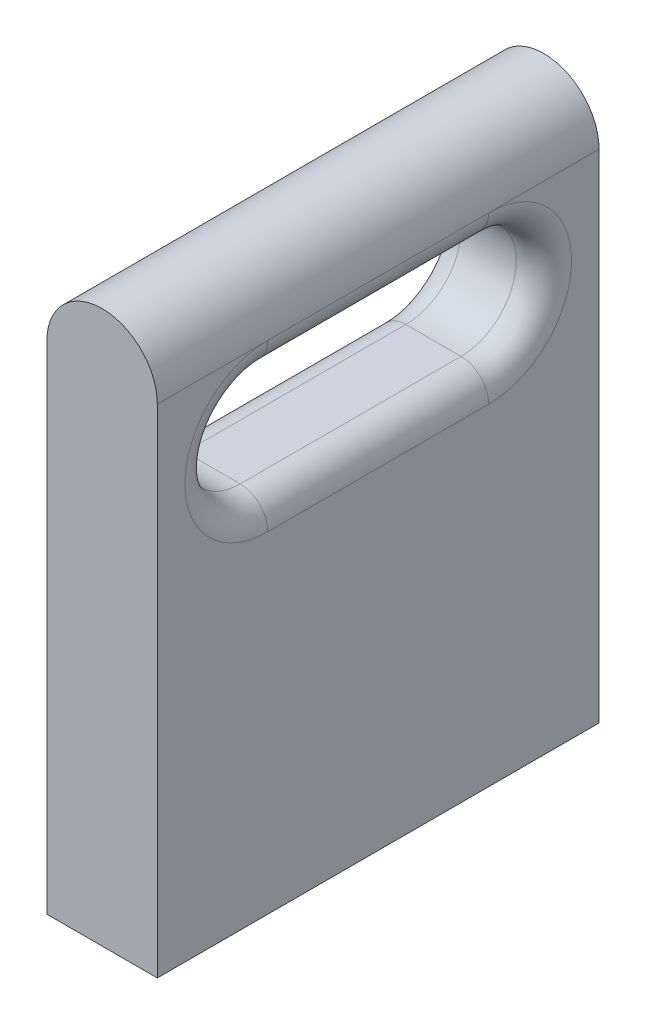
ISO-10303-21;
HEADER;
FILE_DESCRIPTION(('STEP AP214'),'2;1');
FILE_NAME('part.step','',(''),(''),'','','');
FILE_SCHEMA(('AUTOMOTIVE_DESIGN { 1 0 10303 214 1 1 1 1 }'));
ENDSEC;
DATA;
#1=APPLICATION_CONTEXT('core data for automotive mechanical design processes');
#2=APPLICATION_PROTOCOL_DEFINITION('international standard','automotive_design',2000,#1);
#3=PRODUCT_CONTEXT('',#1,'mechanical');
#4=PRODUCT('Part','Part','',(#3));
#5=PRODUCT_RELATED_PRODUCT_CATEGORY('part','',(#4));
#6=PRODUCT_DEFINITION_FORMATION('','',#4);
#7=PRODUCT_DEFINITION_CONTEXT('part definition',#1,'design');
#8=PRODUCT_DEFINITION('design','',#6,#7);
#9=PRODUCT_DEFINITION_SHAPE('','',#8);
#10=(LENGTH_UNIT() NAMED_UNIT(*) SI_UNIT(.MILLI.,.METRE.));
#11=(NAMED_UNIT(*) PLANE_ANGLE_UNIT() SI_UNIT($,.RADIAN.));
#12=(NAMED_UNIT(*) SI_UNIT($,.STERADIAN.) SOLID_ANGLE_UNIT());
#13=UNCERTAINTY_MEASURE_WITH_UNIT(LENGTH_MEASURE(1.E-05),#10,'distance_accuracy_value','');
#14=(GEOMETRIC_REPRESENTATION_CONTEXT(3) GLOBAL_UNCERTAINTY_ASSIGNED_CONTEXT((#13)) GLOBAL_UNIT_ASSIGNED_CONTEXT((#10,
#11,#12)) REPRESENTATION_CONTEXT('',''));
#15=CARTESIAN_POINT('',(0.,0.,0.));
#16=DIRECTION('',(0.,0.,1.));
#17=DIRECTION('',(1.,0.,0.));
#18=AXIS2_PLACEMENT_3D('',#15,#16,#17);
#19=CARTESIAN_POINT('',(0.,0.,101.6));
#20=DIRECTION('',(1.,0.,0.));
#21=DIRECTION('',(0.,0.,-1.));
#22=AXIS2_PLACEMENT_3D('',#19,#20,#21);
#23=PLANE('',#22);
#24=DIRECTION('',(0.,0.,-1.));
#25=VECTOR('',#24,1.);
#26=CARTESIAN_POINT('',(0.,114.3,101.6));
#27=LINE('',#26,#25);
#28=CARTESIAN_POINT('',(0.,114.3,101.6));
#29=VERTEX_POINT('',#28);
#30=CARTESIAN_POINT('',(0.,114.3,76.2));
#31=VERTEX_POINT('',#30);
#32=EDGE_CURVE('E239',#29,#31,#27,.T.);
#33=ORIENTED_EDGE('',*,*,#32,.T.);
#34=CARTESIAN_POINT('',(0.,95.25,76.2));
#35=DIRECTION('',(1.,0.,0.));
#36=DIRECTION('',(0.,0.,-1.));
#37=AXIS2_PLACEMENT_3D('',#34,#35,#36);
#38=CIRCLE('',#37,19.05);
#39=CARTESIAN_POINT('',(0.,76.2,76.2));
#40=VERTEX_POINT('',#39);
#41=EDGE_CURVE('E158',#31,#40,#38,.T.);
#42=ORIENTED_EDGE('',*,*,#41,.T.);
#43=DIRECTION('',(0.,0.,-1.));
#44=VECTOR('',#43,1.);
#45=CARTESIAN_POINT('',(0.,76.2,101.6));
#46=LINE('',#45,#44);
#47=CARTESIAN_POINT('',(0.,76.2,25.4));
#48=VERTEX_POINT('',#47);
#49=EDGE_CURVE('E149',#40,#48,#46,.T.);
#50=ORIENTED_EDGE('',*,*,#49,.T.);
#51=CARTESIAN_POINT('',(0.,95.25,25.4));
#52=DIRECTION('',(1.,0.,0.));
#53=DIRECTION('',(0.,0.,-1.));
#54=AXIS2_PLACEMENT_3D('',#51,#52,#53);
#55=CIRCLE('',#54,19.05);
#56=CARTESIAN_POINT('',(0.,114.3,25.4));
#57=VERTEX_POINT('',#56);
#58=EDGE_CURVE('E151',#48,#57,#55,.T.);
#59=ORIENTED_EDGE('',*,*,#58,.T.);
#60=CARTESIAN_POINT('',(0.,114.3,0.));
#61=VERTEX_POINT('',#60);
#62=EDGE_CURVE('E246',#57,#61,#27,.T.);
#63=ORIENTED_EDGE('',*,*,#62,.T.);
#64=DIRECTION('',(0.,-1.,0.));
#65=VECTOR('',#64,1.);
#66=CARTESIAN_POINT('',(0.,0.,0.));
#67=LINE('',#66,#65);
#68=CARTESIAN_POINT('',(0.,0.,0.));
#69=VERTEX_POINT('',#68);
#70=EDGE_CURVE('E148',#61,#69,#67,.T.);
#71=ORIENTED_EDGE('',*,*,#70,.T.);
#72=DIRECTION('',(0.,0.,-1.));
#73=VECTOR('',#72,1.);
#74=CARTESIAN_POINT('',(0.,0.,101.6));
#75=LINE('',#74,#73);
#76=CARTESIAN_POINT('',(0.,0.,101.6));
#77=VERTEX_POINT('',#76);
#78=EDGE_CURVE('E129',#77,#69,#75,.T.);
#79=ORIENTED_EDGE('',*,*,#78,.F.);
#80=DIRECTION('',(0.,-1.,0.));
#81=VECTOR('',#80,1.);
#82=CARTESIAN_POINT('',(0.,0.,101.6));
#83=LINE('',#82,#81);
#84=EDGE_CURVE('E136',#29,#77,#83,.T.);
#85=ORIENTED_EDGE('',*,*,#84,.F.);
#86=EDGE_LOOP('',(#33,#42,#50,#59,#63,#71,#79,#85));
#87=FACE_BOUND('',#86,.T.);
#88=ADVANCED_FACE('F33',(#87),#23,.F.);
#89=CARTESIAN_POINT('',(0.,0.,101.6));
#90=DIRECTION('',(0.,1.,0.));
#91=DIRECTION('',(0.,0.,1.));
#92=AXIS2_PLACEMENT_3D('',#89,#90,#91);
#93=PLANE('',#92);
#94=DIRECTION('',(1.,0.,0.));
#95=VECTOR('',#94,1.);
#96=CARTESIAN_POINT('',(0.,0.,0.));
#97=LINE('',#96,#95);
#98=CARTESIAN_POINT('',(25.4,0.,0.));
#99=VERTEX_POINT('',#98);
#100=EDGE_CURVE('E249',#69,#99,#97,.T.);
#101=ORIENTED_EDGE('',*,*,#100,.T.);
#102=DIRECTION('',(0.,0.,-1.));
#103=VECTOR('',#102,1.);
#104=CARTESIAN_POINT('',(25.4,0.,101.6));
#105=LINE('',#104,#103);
#106=CARTESIAN_POINT('',(25.4,0.,101.6));
#107=VERTEX_POINT('',#106);
#108=EDGE_CURVE('E132',#107,#99,#105,.T.);
#109=ORIENTED_EDGE('',*,*,#108,.F.);
#110=DIRECTION('',(1.,0.,0.));
#111=VECTOR('',#110,1.);
#112=CARTESIAN_POINT('',(0.,0.,101.6));
#113=LINE('',#112,#111);
#114=EDGE_CURVE('E125',#77,#107,#113,.T.);
#115=ORIENTED_EDGE('',*,*,#114,.F.);
#116=ORIENTED_EDGE('',*,*,#78,.T.);
#117=EDGE_LOOP('',(#101,#109,#115,#116));
#118=FACE_BOUND('',#117,.T.);
#119=ADVANCED_FACE('F127',(#118),#93,.F.);
#120=CARTESIAN_POINT('',(25.4,0.,101.6));
#121=DIRECTION('',(-1.,0.,0.));
#122=DIRECTION('',(0.,0.,1.));
#123=AXIS2_PLACEMENT_3D('',#120,#121,#122);
#124=PLANE('',#123);
#125=DIRECTION('',(0.,0.,-1.));
#126=VECTOR('',#125,1.);
#127=CARTESIAN_POINT('',(25.4,114.3,101.6));
#128=LINE('',#127,#126);
#129=CARTESIAN_POINT('',(25.4,114.3,25.4));
#130=VERTEX_POINT('',#129);
#131=CARTESIAN_POINT('',(25.4,114.3,0.));
#132=VERTEX_POINT('',#131);
#133=EDGE_CURVE('E233',#130,#132,#128,.T.);
#134=ORIENTED_EDGE('',*,*,#133,.F.);
#135=CARTESIAN_POINT('',(25.4,95.25,25.4));
#136=DIRECTION('',(-1.,0.,0.));
#137=DIRECTION('',(0.,0.,1.));
#138=AXIS2_PLACEMENT_3D('',#135,#136,#137);
#139=CIRCLE('',#138,19.05);
#140=CARTESIAN_POINT('',(25.4,76.2,25.4));
#141=VERTEX_POINT('',#140);
#142=EDGE_CURVE('E185',#130,#141,#139,.T.);
#143=ORIENTED_EDGE('',*,*,#142,.T.);
#144=DIRECTION('',(0.,0.,1.));
#145=VECTOR('',#144,1.);
#146=CARTESIAN_POINT('',(25.4,76.2,101.6));
#147=LINE('',#146,#145);
#148=CARTESIAN_POINT('',(25.4,76.2,76.2));
#149=VERTEX_POINT('',#148);
#150=EDGE_CURVE('E170',#141,#149,#147,.T.);
#151=ORIENTED_EDGE('',*,*,#150,.T.);
#152=CARTESIAN_POINT('',(25.4,95.25,76.2));
#153=DIRECTION('',(-1.,0.,0.));
#154=DIRECTION('',(0.,0.,1.));
#155=AXIS2_PLACEMENT_3D('',#152,#153,#154);
#156=CIRCLE('',#155,19.05);
#157=CARTESIAN_POINT('',(25.4,114.3,76.2));
#158=VERTEX_POINT('',#157);
#159=EDGE_CURVE('E183',#149,#158,#156,.T.);
#160=ORIENTED_EDGE('',*,*,#159,.T.);
#161=CARTESIAN_POINT('',(25.4,114.3,101.6));
#162=VERTEX_POINT('',#161);
#163=EDGE_CURVE('E153',#162,#158,#128,.T.);
#164=ORIENTED_EDGE('',*,*,#163,.F.);
#165=DIRECTION('',(0.,1.,0.));
#166=VECTOR('',#165,1.);
#167=CARTESIAN_POINT('',(25.4,0.,101.6));
#168=LINE('',#167,#166);
#169=EDGE_CURVE('E135',#107,#162,#168,.T.);
#170=ORIENTED_EDGE('',*,*,#169,.F.);
#171=ORIENTED_EDGE('',*,*,#108,.T.);
#172=DIRECTION('',(0.,1.,0.));
#173=VECTOR('',#172,1.);
#174=CARTESIAN_POINT('',(25.4,0.,0.));
#175=LINE('',#174,#173);
#176=EDGE_CURVE('E235',#99,#132,#175,.T.);
#177=ORIENTED_EDGE('',*,*,#176,.T.);
#178=EDGE_LOOP('',(#134,#143,#151,#160,#164,#170,#171,#177));
#179=FACE_BOUND('',#178,.T.);
#180=ADVANCED_FACE('F231',(#179),#124,.F.);
#181=CARTESIAN_POINT('',(12.7,114.3,101.6));
#182=DIRECTION('',(0.,0.,-1.));
#183=DIRECTION('',(-1.,0.,0.));
#184=AXIS2_PLACEMENT_3D('',#181,#182,#183);
#185=CYLINDRICAL_SURFACE('',#184,12.7);
#186=CARTESIAN_POINT('',(12.7,114.3,0.));
#187=DIRECTION('',(0.,0.,1.));
#188=DIRECTION('',(-1.,0.,0.));
#189=AXIS2_PLACEMENT_3D('',#186,#187,#188);
#190=CIRCLE('',#189,12.7);
#191=EDGE_CURVE('E145',#132,#61,#190,.T.);
#192=ORIENTED_EDGE('',*,*,#191,.T.);
#193=ORIENTED_EDGE('',*,*,#62,.F.);
#194=EDGE_CURVE('E245',#31,#57,#27,.T.);
#195=ORIENTED_EDGE('',*,*,#194,.F.);
#196=ORIENTED_EDGE('',*,*,#32,.F.);
#197=CARTESIAN_POINT('',(12.7,114.3,101.6));
#198=DIRECTION('',(0.,0.,1.));
#199=DIRECTION('',(-1.,0.,0.));
#200=AXIS2_PLACEMENT_3D('',#197,#198,#199);
#201=CIRCLE('',#200,12.7);
#202=EDGE_CURVE('E141',#162,#29,#201,.T.);
#203=ORIENTED_EDGE('',*,*,#202,.F.);
#204=ORIENTED_EDGE('',*,*,#163,.T.);
#205=EDGE_CURVE('E209',#158,#130,#128,.T.);
#206=ORIENTED_EDGE('',*,*,#205,.T.);
#207=ORIENTED_EDGE('',*,*,#133,.T.);
#208=EDGE_LOOP('',(#192,#193,#195,#196,#203,#204,#206,#207));
#209=FACE_BOUND('',#208,.T.);
#210=ADVANCED_FACE('F241',(#209),#185,.T.);
#211=CARTESIAN_POINT('',(12.7,114.3,101.6));
#212=DIRECTION('',(0.,0.,-1.));
#213=DIRECTION('',(-1.,0.,0.));
#214=AXIS2_PLACEMENT_3D('',#211,#212,#213);
#215=PLANE('',#214);
#216=ORIENTED_EDGE('',*,*,#84,.T.);
#217=ORIENTED_EDGE('',*,*,#114,.T.);
#218=ORIENTED_EDGE('',*,*,#169,.T.);
#219=ORIENTED_EDGE('',*,*,#202,.T.);
#220=EDGE_LOOP('',(#216,#217,#218,#219));
#221=FACE_BOUND('',#220,.T.);
#222=ADVANCED_FACE('F139',(#221),#215,.F.);
#223=CARTESIAN_POINT('',(12.7,114.3,0.));
#224=DIRECTION('',(0.,0.,-1.));
#225=DIRECTION('',(-1.,0.,0.));
#226=AXIS2_PLACEMENT_3D('',#223,#224,#225);
#227=PLANE('',#226);
#228=ORIENTED_EDGE('',*,*,#70,.F.);
#229=ORIENTED_EDGE('',*,*,#191,.F.);
#230=ORIENTED_EDGE('',*,*,#176,.F.);
#231=ORIENTED_EDGE('',*,*,#100,.F.);
#232=EDGE_LOOP('',(#228,#229,#230,#231));
#233=FACE_BOUND('',#232,.T.);
#234=ADVANCED_FACE('F273',(#233),#227,.T.);
#235=CARTESIAN_POINT('',(0.,95.25,76.2));
#236=DIRECTION('',(1.,0.,0.));
#237=DIRECTION('',(0.,0.,-1.));
#238=AXIS2_PLACEMENT_3D('',#235,#236,#237);
#239=CYLINDRICAL_SURFACE('',#238,12.7);
#240=DIRECTION('',(1.,0.,0.));
#241=VECTOR('',#240,1.);
#242=CARTESIAN_POINT('',(0.,107.95,76.2));
#243=LINE('',#242,#241);
#244=CARTESIAN_POINT('',(6.35,107.95,76.2));
#245=VERTEX_POINT('',#244);
#246=CARTESIAN_POINT('',(19.05,107.95,76.2));
#247=VERTEX_POINT('',#246);
#248=EDGE_CURVE('E252',#245,#247,#243,.T.);
#249=ORIENTED_EDGE('',*,*,#248,.T.);
#250=CARTESIAN_POINT('',(19.05,95.25,76.2));
#251=DIRECTION('',(-1.,0.,0.));
#252=DIRECTION('',(0.,0.,1.));
#253=AXIS2_PLACEMENT_3D('',#250,#251,#252);
#254=CIRCLE('',#253,12.7);
#255=CARTESIAN_POINT('',(19.05,82.55,76.2));
#256=VERTEX_POINT('',#255);
#257=EDGE_CURVE('E42',#247,#256,#254,.F.);
#258=ORIENTED_EDGE('',*,*,#257,.T.);
#259=DIRECTION('',(1.,0.,0.));
#260=VECTOR('',#259,1.);
#261=CARTESIAN_POINT('',(0.,82.55,76.2));
#262=LINE('',#261,#260);
#263=CARTESIAN_POINT('',(6.35,82.55,76.2));
#264=VERTEX_POINT('',#263);
#265=EDGE_CURVE('E181',#264,#256,#262,.T.);
#266=ORIENTED_EDGE('',*,*,#265,.F.);
#267=CARTESIAN_POINT('',(6.35,95.25,76.2));
#268=DIRECTION('',(1.,0.,0.));
#269=DIRECTION('',(0.,0.,-1.));
#270=AXIS2_PLACEMENT_3D('',#267,#268,#269);
#271=CIRCLE('',#270,12.7);
#272=EDGE_CURVE('E161',#264,#245,#271,.F.);
#273=ORIENTED_EDGE('',*,*,#272,.T.);
#274=EDGE_LOOP('',(#249,#258,#266,#273));
#275=FACE_BOUND('',#274,.T.);
#276=ADVANCED_FACE('F257',(#275),#239,.F.);
#277=CARTESIAN_POINT('',(0.,107.95,76.2));
#278=DIRECTION('',(0.,-1.,0.));
#279=DIRECTION('',(0.,0.,-1.));
#280=AXIS2_PLACEMENT_3D('',#277,#278,#279);
#281=PLANE('',#280);
#282=DIRECTION('',(1.,0.,0.));
#283=VECTOR('',#282,1.);
#284=CARTESIAN_POINT('',(0.,107.95,25.4));
#285=LINE('',#284,#283);
#286=CARTESIAN_POINT('',(6.35,107.95,25.4));
#287=VERTEX_POINT('',#286);
#288=CARTESIAN_POINT('',(19.05,107.95,25.4));
#289=VERTEX_POINT('',#288);
#290=EDGE_CURVE('E225',#287,#289,#285,.T.);
#291=ORIENTED_EDGE('',*,*,#290,.T.);
#292=DIRECTION('',(0.,0.,1.));
#293=VECTOR('',#292,1.);
#294=CARTESIAN_POINT('',(19.05,107.95,76.2));
#295=LINE('',#294,#293);
#296=EDGE_CURVE('E57',#289,#247,#295,.T.);
#297=ORIENTED_EDGE('',*,*,#296,.T.);
#298=ORIENTED_EDGE('',*,*,#248,.F.);
#299=DIRECTION('',(0.,0.,-1.));
#300=VECTOR('',#299,1.);
#301=CARTESIAN_POINT('',(6.35,107.95,25.4));
#302=LINE('',#301,#300);
#303=EDGE_CURVE('E164',#245,#287,#302,.T.);
#304=ORIENTED_EDGE('',*,*,#303,.T.);
#305=EDGE_LOOP('',(#291,#297,#298,#304));
#306=FACE_BOUND('',#305,.T.);
#307=ADVANCED_FACE('F259',(#306),#281,.T.);
#308=CARTESIAN_POINT('',(0.,95.25,25.4));
#309=DIRECTION('',(1.,0.,0.));
#310=DIRECTION('',(0.,0.,-1.));
#311=AXIS2_PLACEMENT_3D('',#308,#309,#310);
#312=CYLINDRICAL_SURFACE('',#311,12.7);
#313=DIRECTION('',(1.,0.,0.));
#314=VECTOR('',#313,1.);
#315=CARTESIAN_POINT('',(0.,82.55,25.4));
#316=LINE('',#315,#314);
#317=CARTESIAN_POINT('',(6.35,82.55,25.4));
#318=VERTEX_POINT('',#317);
#319=CARTESIAN_POINT('',(19.05,82.55,25.4));
#320=VERTEX_POINT('',#319);
#321=EDGE_CURVE('E218',#318,#320,#316,.T.);
#322=ORIENTED_EDGE('',*,*,#321,.T.);
#323=CARTESIAN_POINT('',(19.05,95.25,25.4));
#324=DIRECTION('',(-1.,0.,0.));
#325=DIRECTION('',(0.,0.,1.));
#326=AXIS2_PLACEMENT_3D('',#323,#324,#325);
#327=CIRCLE('',#326,12.7);
#328=EDGE_CURVE('E188',#320,#289,#327,.F.);
#329=ORIENTED_EDGE('',*,*,#328,.T.);
#330=ORIENTED_EDGE('',*,*,#290,.F.);
#331=CARTESIAN_POINT('',(6.35,95.25,25.4));
#332=DIRECTION('',(1.,0.,0.));
#333=DIRECTION('',(0.,0.,-1.));
#334=AXIS2_PLACEMENT_3D('',#331,#332,#333);
#335=CIRCLE('',#334,12.7);
#336=EDGE_CURVE('E166',#287,#318,#335,.F.);
#337=ORIENTED_EDGE('',*,*,#336,.T.);
#338=EDGE_LOOP('',(#322,#329,#330,#337));
#339=FACE_BOUND('',#338,.T.);
#340=ADVANCED_FACE('F222',(#339),#312,.F.);
#341=CARTESIAN_POINT('',(0.,82.55,76.2));
#342=DIRECTION('',(0.,-1.,0.));
#343=DIRECTION('',(0.,0.,-1.));
#344=AXIS2_PLACEMENT_3D('',#341,#342,#343);
#345=PLANE('',#344);
#346=ORIENTED_EDGE('',*,*,#265,.T.);
#347=DIRECTION('',(0.,0.,1.));
#348=VECTOR('',#347,1.);
#349=CARTESIAN_POINT('',(19.05,82.55,76.2));
#350=LINE('',#349,#348);
#351=EDGE_CURVE('E11',#256,#320,#350,.F.);
#352=ORIENTED_EDGE('',*,*,#351,.T.);
#353=ORIENTED_EDGE('',*,*,#321,.F.);
#354=DIRECTION('',(0.,0.,-1.));
#355=VECTOR('',#354,1.);
#356=CARTESIAN_POINT('',(6.35,82.55,76.2));
#357=LINE('',#356,#355);
#358=EDGE_CURVE('E168',#318,#264,#357,.F.);
#359=ORIENTED_EDGE('',*,*,#358,.T.);
#360=EDGE_LOOP('',(#346,#352,#353,#359));
#361=FACE_BOUND('',#360,.T.);
#362=ADVANCED_FACE('F217',(#361),#345,.F.);
#363=CARTESIAN_POINT('',(6.35,95.25,25.4));
#364=DIRECTION('',(1.,0.,0.));
#365=DIRECTION('',(0.,0.,-1.));
#366=AXIS2_PLACEMENT_3D('',#363,#364,#365);
#367=TOROIDAL_SURFACE('',#366,19.05,6.35);
#368=CARTESIAN_POINT('',(6.35,76.2,25.4));
#369=DIRECTION('',(0.,0.,1.));
#370=DIRECTION('',(1.,0.,0.));
#371=AXIS2_PLACEMENT_3D('',#368,#369,#370);
#372=CIRCLE('',#371,6.35);
#373=EDGE_CURVE('E175',#318,#48,#372,.T.);
#374=ORIENTED_EDGE('',*,*,#373,.F.);
#375=ORIENTED_EDGE('',*,*,#336,.F.);
#376=CARTESIAN_POINT('',(6.35,114.3,25.4));
#377=DIRECTION('',(0.,0.,1.));
#378=DIRECTION('',(1.,0.,0.));
#379=AXIS2_PLACEMENT_3D('',#376,#377,#378);
#380=CIRCLE('',#379,6.35);
#381=EDGE_CURVE('E178',#57,#287,#380,.T.);
#382=ORIENTED_EDGE('',*,*,#381,.F.);
#383=ORIENTED_EDGE('',*,*,#58,.F.);
#384=EDGE_LOOP('',(#374,#375,#382,#383));
#385=FACE_BOUND('',#384,.T.);
#386=ADVANCED_FACE('F265',(#385),#367,.T.);
#387=CARTESIAN_POINT('',(6.35,114.3,76.2));
#388=DIRECTION('',(0.,0.,1.));
#389=DIRECTION('',(1.,0.,0.));
#390=AXIS2_PLACEMENT_3D('',#387,#388,#389);
#391=CYLINDRICAL_SURFACE('',#390,6.35);
#392=ORIENTED_EDGE('',*,*,#381,.T.);
#393=ORIENTED_EDGE('',*,*,#303,.F.);
#394=CARTESIAN_POINT('',(6.35,114.3,76.2));
#395=DIRECTION('',(0.,0.,1.));
#396=DIRECTION('',(1.,0.,0.));
#397=AXIS2_PLACEMENT_3D('',#394,#395,#396);
#398=CIRCLE('',#397,6.35);
#399=EDGE_CURVE('E173',#31,#245,#398,.T.);
#400=ORIENTED_EDGE('',*,*,#399,.F.);
#401=ORIENTED_EDGE('',*,*,#194,.T.);
#402=EDGE_LOOP('',(#392,#393,#400,#401));
#403=FACE_BOUND('',#402,.T.);
#404=ADVANCED_FACE('F269',(#403),#391,.T.);
#405=CARTESIAN_POINT('',(6.35,76.2,101.6));
#406=DIRECTION('',(0.,0.,-1.));
#407=DIRECTION('',(-1.,0.,0.));
#408=AXIS2_PLACEMENT_3D('',#405,#406,#407);
#409=CYLINDRICAL_SURFACE('',#408,6.35);
#410=ORIENTED_EDGE('',*,*,#373,.T.);
#411=ORIENTED_EDGE('',*,*,#49,.F.);
#412=CARTESIAN_POINT('',(6.35,76.2,76.2));
#413=DIRECTION('',(0.,0.,1.));
#414=DIRECTION('',(1.,0.,0.));
#415=AXIS2_PLACEMENT_3D('',#412,#413,#414);
#416=CIRCLE('',#415,6.35);
#417=EDGE_CURVE('E171',#264,#40,#416,.T.);
#418=ORIENTED_EDGE('',*,*,#417,.F.);
#419=ORIENTED_EDGE('',*,*,#358,.F.);
#420=EDGE_LOOP('',(#410,#411,#418,#419));
#421=FACE_BOUND('',#420,.T.);
#422=ADVANCED_FACE('F279',(#421),#409,.T.);
#423=CARTESIAN_POINT('',(6.35,95.25,76.2));
#424=DIRECTION('',(1.,0.,0.));
#425=DIRECTION('',(0.,0.,-1.));
#426=AXIS2_PLACEMENT_3D('',#423,#424,#425);
#427=TOROIDAL_SURFACE('',#426,19.05,6.35);
#428=ORIENTED_EDGE('',*,*,#399,.T.);
#429=ORIENTED_EDGE('',*,*,#272,.F.);
#430=ORIENTED_EDGE('',*,*,#417,.T.);
#431=ORIENTED_EDGE('',*,*,#41,.F.);
#432=EDGE_LOOP('',(#428,#429,#430,#431));
#433=FACE_BOUND('',#432,.T.);
#434=ADVANCED_FACE('F276',(#433),#427,.T.);
#435=CARTESIAN_POINT('',(19.05,95.25,76.2));
#436=DIRECTION('',(-1.,0.,0.));
#437=DIRECTION('',(0.,0.,1.));
#438=AXIS2_PLACEMENT_3D('',#435,#436,#437);
#439=TOROIDAL_SURFACE('',#438,19.05,6.35);
#440=CARTESIAN_POINT('',(19.05,76.2,76.2));
#441=DIRECTION('',(0.,0.,-1.));
#442=DIRECTION('',(-1.,0.,0.));
#443=AXIS2_PLACEMENT_3D('',#440,#441,#442);
#444=CIRCLE('',#443,6.35);
#445=EDGE_CURVE('E196',#256,#149,#444,.T.);
#446=ORIENTED_EDGE('',*,*,#445,.F.);
#447=ORIENTED_EDGE('',*,*,#257,.F.);
#448=CARTESIAN_POINT('',(19.05,114.3,76.2));
#449=DIRECTION('',(0.,0.,-1.));
#450=DIRECTION('',(-1.,0.,0.));
#451=AXIS2_PLACEMENT_3D('',#448,#449,#450);
#452=CIRCLE('',#451,6.35);
#453=EDGE_CURVE('E37',#158,#247,#452,.T.);
#454=ORIENTED_EDGE('',*,*,#453,.F.);
#455=ORIENTED_EDGE('',*,*,#159,.F.);
#456=EDGE_LOOP('',(#446,#447,#454,#455));
#457=FACE_BOUND('',#456,.T.);
#458=ADVANCED_FACE('F35',(#457),#439,.T.);
#459=CARTESIAN_POINT('',(19.05,114.3,76.2));
#460=DIRECTION('',(0.,0.,-1.));
#461=DIRECTION('',(-1.,0.,0.));
#462=AXIS2_PLACEMENT_3D('',#459,#460,#461);
#463=CYLINDRICAL_SURFACE('',#462,6.35);
#464=ORIENTED_EDGE('',*,*,#453,.T.);
#465=ORIENTED_EDGE('',*,*,#296,.F.);
#466=CARTESIAN_POINT('',(19.05,114.3,25.4));
#467=DIRECTION('',(0.,0.,-1.));
#468=DIRECTION('',(-1.,0.,0.));
#469=AXIS2_PLACEMENT_3D('',#466,#467,#468);
#470=CIRCLE('',#469,6.35);
#471=EDGE_CURVE('E195',#130,#289,#470,.T.);
#472=ORIENTED_EDGE('',*,*,#471,.F.);
#473=ORIENTED_EDGE('',*,*,#205,.F.);
#474=EDGE_LOOP('',(#464,#465,#472,#473));
#475=FACE_BOUND('',#474,.T.);
#476=ADVANCED_FACE('F206',(#475),#463,.T.);
#477=CARTESIAN_POINT('',(19.05,76.2,101.6));
#478=DIRECTION('',(0.,0.,1.));
#479=DIRECTION('',(1.,0.,0.));
#480=AXIS2_PLACEMENT_3D('',#477,#478,#479);
#481=CYLINDRICAL_SURFACE('',#480,6.35);
#482=ORIENTED_EDGE('',*,*,#445,.T.);
#483=ORIENTED_EDGE('',*,*,#150,.F.);
#484=CARTESIAN_POINT('',(19.05,76.2,25.4));
#485=DIRECTION('',(0.,0.,-1.));
#486=DIRECTION('',(-1.,0.,0.));
#487=AXIS2_PLACEMENT_3D('',#484,#485,#486);
#488=CIRCLE('',#487,6.35);
#489=EDGE_CURVE('E193',#320,#141,#488,.T.);
#490=ORIENTED_EDGE('',*,*,#489,.F.);
#491=ORIENTED_EDGE('',*,*,#351,.F.);
#492=EDGE_LOOP('',(#482,#483,#490,#491));
#493=FACE_BOUND('',#492,.T.);
#494=ADVANCED_FACE('F213',(#493),#481,.T.);
#495=CARTESIAN_POINT('',(19.05,95.25,25.4));
#496=DIRECTION('',(-1.,0.,0.));
#497=DIRECTION('',(0.,0.,1.));
#498=AXIS2_PLACEMENT_3D('',#495,#496,#497);
#499=TOROIDAL_SURFACE('',#498,19.05,6.35);
#500=ORIENTED_EDGE('',*,*,#471,.T.);
#501=ORIENTED_EDGE('',*,*,#328,.F.);
#502=ORIENTED_EDGE('',*,*,#489,.T.);
#503=ORIENTED_EDGE('',*,*,#142,.F.);
#504=EDGE_LOOP('',(#500,#501,#502,#503));
#505=FACE_BOUND('',#504,.T.);
#506=ADVANCED_FACE('F228',(#505),#499,.T.);
#507=CLOSED_SHELL('',(#88,#119,#180,#210,#222,#234,#276,#307,#340,#362,#386,#404,#422,#434,#458,
#476,#494,#506));
#508=MANIFOLD_SOLID_BREP('B2',#507);
#509=ADVANCED_BREP_SHAPE_REPRESENTATION('',(#18,#508),#14);
#510=SHAPE_DEFINITION_REPRESENTATION(#9,#509);
ENDSEC;
END-ISO-10303-21;
